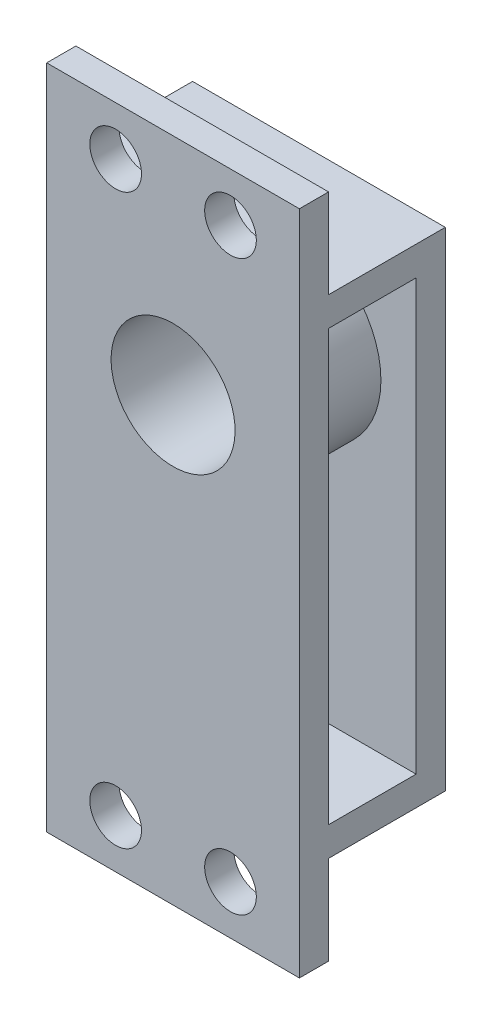
ISO-10303-21;
HEADER;
FILE_DESCRIPTION(('STEP AP214'),'2;1');
FILE_NAME('part.step','',(''),(''),'','','');
FILE_SCHEMA(('AUTOMOTIVE_DESIGN { 1 0 10303 214 1 1 1 1 }'));
ENDSEC;
DATA;
#1=APPLICATION_CONTEXT('core data for automotive mechanical design processes');
#2=APPLICATION_PROTOCOL_DEFINITION('international standard','automotive_design',2000,#1);
#3=PRODUCT_CONTEXT('',#1,'mechanical');
#4=PRODUCT('Part','Part','',(#3));
#5=PRODUCT_RELATED_PRODUCT_CATEGORY('part','',(#4));
#6=PRODUCT_DEFINITION_FORMATION('','',#4);
#7=PRODUCT_DEFINITION_CONTEXT('part definition',#1,'design');
#8=PRODUCT_DEFINITION('design','',#6,#7);
#9=PRODUCT_DEFINITION_SHAPE('','',#8);
#10=(LENGTH_UNIT() NAMED_UNIT(*) SI_UNIT(.MILLI.,.METRE.));
#11=(NAMED_UNIT(*) PLANE_ANGLE_UNIT() SI_UNIT($,.RADIAN.));
#12=(NAMED_UNIT(*) SI_UNIT($,.STERADIAN.) SOLID_ANGLE_UNIT());
#13=UNCERTAINTY_MEASURE_WITH_UNIT(LENGTH_MEASURE(1.E-05),#10,'distance_accuracy_value','');
#14=(GEOMETRIC_REPRESENTATION_CONTEXT(3) GLOBAL_UNCERTAINTY_ASSIGNED_CONTEXT((#13)) GLOBAL_UNIT_ASSIGNED_CONTEXT((#10,
#11,#12)) REPRESENTATION_CONTEXT('',''));
#15=CARTESIAN_POINT('',(0.,0.,0.));
#16=DIRECTION('',(0.,0.,1.));
#17=DIRECTION('',(1.,0.,0.));
#18=AXIS2_PLACEMENT_3D('',#15,#16,#17);
#19=CARTESIAN_POINT('',(0.,0.,0.));
#20=DIRECTION('',(0.,0.,1.));
#21=DIRECTION('',(1.,0.,0.));
#22=AXIS2_PLACEMENT_3D('',#19,#20,#21);
#23=PLANE('',#22);
#24=CARTESIAN_POINT('',(0.,9.4592,0.));
#25=DIRECTION('',(0.,0.,1.));
#26=DIRECTION('',(1.,0.,0.));
#27=AXIS2_PLACEMENT_3D('',#24,#25,#26);
#28=CIRCLE('',#27,7.9375);
#29=CARTESIAN_POINT('',(7.9375,9.4592,0.));
#30=VERTEX_POINT('',#29);
#31=EDGE_CURVE('E305',#30,#30,#28,.F.);
#32=ORIENTED_EDGE('',*,*,#31,.F.);
#33=EDGE_LOOP('',(#32));
#34=FACE_BOUND('',#33,.T.);
#35=DIRECTION('',(-1.,0.,0.));
#36=VECTOR('',#35,1.);
#37=CARTESIAN_POINT('',(54.6975468418995,-18.71,0.));
#38=LINE('',#37,#36);
#39=CARTESIAN_POINT('',(11.,-18.71,0.));
#40=VERTEX_POINT('',#39);
#41=CARTESIAN_POINT('',(-11.,-18.71,0.));
#42=VERTEX_POINT('',#41);
#43=EDGE_CURVE('E71',#40,#42,#38,.T.);
#44=ORIENTED_EDGE('',*,*,#43,.T.);
#45=DIRECTION('',(0.,-1.,0.));
#46=VECTOR('',#45,1.);
#47=CARTESIAN_POINT('',(-11.,29.,0.));
#48=LINE('',#47,#46);
#49=CARTESIAN_POINT('',(-11.,18.71,0.));
#50=VERTEX_POINT('',#49);
#51=EDGE_CURVE('E166',#50,#42,#48,.T.);
#52=ORIENTED_EDGE('',*,*,#51,.F.);
#53=DIRECTION('',(-1.,0.,0.));
#54=VECTOR('',#53,1.);
#55=CARTESIAN_POINT('',(54.6975468418995,18.71,0.));
#56=LINE('',#55,#54);
#57=CARTESIAN_POINT('',(11.,18.71,0.));
#58=VERTEX_POINT('',#57);
#59=EDGE_CURVE('E199',#58,#50,#56,.T.);
#60=ORIENTED_EDGE('',*,*,#59,.F.);
#61=DIRECTION('',(0.,1.,0.));
#62=VECTOR('',#61,1.);
#63=CARTESIAN_POINT('',(11.,29.,0.));
#64=LINE('',#63,#62);
#65=EDGE_CURVE('E214',#40,#58,#64,.T.);
#66=ORIENTED_EDGE('',*,*,#65,.F.);
#67=EDGE_LOOP('',(#44,#52,#60,#66));
#68=FACE_BOUND('',#67,.T.);
#69=ADVANCED_FACE('F48',(#34,#68),#23,.F.);
#70=CARTESIAN_POINT('',(5.,24.75,0.));
#71=DIRECTION('',(0.,0.,-1.));
#72=DIRECTION('',(-1.,0.,0.));
#73=AXIS2_PLACEMENT_3D('',#70,#71,#72);
#74=CIRCLE('',#73,2.25);
#75=CARTESIAN_POINT('',(2.75,24.75,0.));
#76=VERTEX_POINT('',#75);
#77=EDGE_CURVE('E341',#76,#76,#74,.T.);
#78=ORIENTED_EDGE('',*,*,#77,.F.);
#79=EDGE_LOOP('',(#78));
#80=FACE_BOUND('',#79,.T.);
#81=CARTESIAN_POINT('',(-5.,24.75,0.));
#82=DIRECTION('',(0.,0.,-1.));
#83=DIRECTION('',(-1.,0.,0.));
#84=AXIS2_PLACEMENT_3D('',#81,#82,#83);
#85=CIRCLE('',#84,2.25);
#86=CARTESIAN_POINT('',(-7.25,24.75,0.));
#87=VERTEX_POINT('',#86);
#88=EDGE_CURVE('E345',#87,#87,#85,.T.);
#89=ORIENTED_EDGE('',*,*,#88,.F.);
#90=EDGE_LOOP('',(#89));
#91=FACE_BOUND('',#90,.T.);
#92=CARTESIAN_POINT('',(11.,21.25,0.));
#93=VERTEX_POINT('',#92);
#94=CARTESIAN_POINT('',(11.,29.,0.));
#95=VERTEX_POINT('',#94);
#96=EDGE_CURVE('E197',#93,#95,#64,.T.);
#97=ORIENTED_EDGE('',*,*,#96,.F.);
#98=DIRECTION('',(-1.,0.,0.));
#99=VECTOR('',#98,1.);
#100=CARTESIAN_POINT('',(54.6975468418995,21.25,0.));
#101=LINE('',#100,#99);
#102=CARTESIAN_POINT('',(-11.,21.25,0.));
#103=VERTEX_POINT('',#102);
#104=EDGE_CURVE('E63',#93,#103,#101,.T.);
#105=ORIENTED_EDGE('',*,*,#104,.T.);
#106=CARTESIAN_POINT('',(-11.,29.,0.));
#107=VERTEX_POINT('',#106);
#108=EDGE_CURVE('E169',#107,#103,#48,.T.);
#109=ORIENTED_EDGE('',*,*,#108,.F.);
#110=DIRECTION('',(-1.,0.,0.));
#111=VECTOR('',#110,1.);
#112=CARTESIAN_POINT('',(-11.,29.,0.));
#113=LINE('',#112,#111);
#114=EDGE_CURVE('E167',#95,#107,#113,.T.);
#115=ORIENTED_EDGE('',*,*,#114,.F.);
#116=EDGE_LOOP('',(#97,#105,#109,#115));
#117=FACE_BOUND('',#116,.T.);
#118=ADVANCED_FACE('F196',(#80,#91,#117),#23,.F.);
#119=CARTESIAN_POINT('',(11.,29.,2.53999999999999));
#120=DIRECTION('',(-1.,0.,0.));
#121=DIRECTION('',(0.,-1.,0.));
#122=AXIS2_PLACEMENT_3D('',#119,#120,#121);
#123=PLANE('',#122);
#124=DIRECTION('',(0.,0.,1.));
#125=VECTOR('',#124,1.);
#126=CARTESIAN_POINT('',(11.,21.25,0.));
#127=LINE('',#126,#125);
#128=CARTESIAN_POINT('',(11.,21.25,-10.16));
#129=VERTEX_POINT('',#128);
#130=EDGE_CURVE('E220',#129,#93,#127,.T.);
#131=ORIENTED_EDGE('',*,*,#130,.T.);
#132=ORIENTED_EDGE('',*,*,#96,.T.);
#133=DIRECTION('',(0.,0.,-1.));
#134=VECTOR('',#133,1.);
#135=CARTESIAN_POINT('',(11.,29.,2.53999999999999));
#136=LINE('',#135,#134);
#137=CARTESIAN_POINT('',(11.,29.,2.53999999999999));
#138=VERTEX_POINT('',#137);
#139=EDGE_CURVE('E13',#138,#95,#136,.T.);
#140=ORIENTED_EDGE('',*,*,#139,.F.);
#141=DIRECTION('',(0.,1.,0.));
#142=VECTOR('',#141,1.);
#143=CARTESIAN_POINT('',(11.,29.,2.53999999999999));
#144=LINE('',#143,#142);
#145=CARTESIAN_POINT('',(11.,-29.,2.53999999999999));
#146=VERTEX_POINT('',#145);
#147=EDGE_CURVE('E177',#146,#138,#144,.T.);
#148=ORIENTED_EDGE('',*,*,#147,.F.);
#149=DIRECTION('',(0.,0.,-1.));
#150=VECTOR('',#149,1.);
#151=CARTESIAN_POINT('',(11.,-29.,2.53999999999999));
#152=LINE('',#151,#150);
#153=CARTESIAN_POINT('',(11.,-29.,0.));
#154=VERTEX_POINT('',#153);
#155=EDGE_CURVE('E185',#146,#154,#152,.T.);
#156=ORIENTED_EDGE('',*,*,#155,.T.);
#157=CARTESIAN_POINT('',(11.,-21.25,0.));
#158=VERTEX_POINT('',#157);
#159=EDGE_CURVE('E171',#154,#158,#64,.T.);
#160=ORIENTED_EDGE('',*,*,#159,.T.);
#161=DIRECTION('',(0.,0.,-1.));
#162=VECTOR('',#161,1.);
#163=CARTESIAN_POINT('',(11.,-21.25,-10.16));
#164=LINE('',#163,#162);
#165=CARTESIAN_POINT('',(11.,-21.25,-10.16));
#166=VERTEX_POINT('',#165);
#167=EDGE_CURVE('E145',#158,#166,#164,.T.);
#168=ORIENTED_EDGE('',*,*,#167,.T.);
#169=DIRECTION('',(0.,1.,0.));
#170=VECTOR('',#169,1.);
#171=CARTESIAN_POINT('',(11.,21.25,-10.16));
#172=LINE('',#171,#170);
#173=EDGE_CURVE('E218',#166,#129,#172,.T.);
#174=ORIENTED_EDGE('',*,*,#173,.T.);
#175=EDGE_LOOP('',(#131,#132,#140,#148,#156,#160,#168,#174));
#176=FACE_BOUND('',#175,.T.);
#177=ORIENTED_EDGE('',*,*,#65,.T.);
#178=DIRECTION('',(0.,0.,1.));
#179=VECTOR('',#178,1.);
#180=CARTESIAN_POINT('',(11.,18.71,0.));
#181=LINE('',#180,#179);
#182=CARTESIAN_POINT('',(11.,18.71,-7.61999999999999));
#183=VERTEX_POINT('',#182);
#184=EDGE_CURVE('E239',#183,#58,#181,.T.);
#185=ORIENTED_EDGE('',*,*,#184,.F.);
#186=DIRECTION('',(0.,1.,0.));
#187=VECTOR('',#186,1.);
#188=CARTESIAN_POINT('',(11.,21.25,-7.61999999999999));
#189=LINE('',#188,#187);
#190=CARTESIAN_POINT('',(11.,-18.71,-7.61999999999999));
#191=VERTEX_POINT('',#190);
#192=EDGE_CURVE('E236',#191,#183,#189,.T.);
#193=ORIENTED_EDGE('',*,*,#192,.F.);
#194=DIRECTION('',(0.,0.,-1.));
#195=VECTOR('',#194,1.);
#196=CARTESIAN_POINT('',(11.,-18.71,-10.16));
#197=LINE('',#196,#195);
#198=EDGE_CURVE('E233',#40,#191,#197,.T.);
#199=ORIENTED_EDGE('',*,*,#198,.F.);
#200=EDGE_LOOP('',(#177,#185,#193,#199));
#201=FACE_BOUND('',#200,.T.);
#202=ADVANCED_FACE('F50',(#176,#201),#123,.F.);
#203=CARTESIAN_POINT('',(-11.,29.,2.53999999999999));
#204=DIRECTION('',(0.,-1.,0.));
#205=DIRECTION('',(0.,0.,-1.));
#206=AXIS2_PLACEMENT_3D('',#203,#204,#205);
#207=PLANE('',#206);
#208=ORIENTED_EDGE('',*,*,#114,.T.);
#209=DIRECTION('',(0.,0.,-1.));
#210=VECTOR('',#209,1.);
#211=CARTESIAN_POINT('',(-11.,29.,2.53999999999999));
#212=LINE('',#211,#210);
#213=CARTESIAN_POINT('',(-11.,29.,2.53999999999999));
#214=VERTEX_POINT('',#213);
#215=EDGE_CURVE('E56',#214,#107,#212,.T.);
#216=ORIENTED_EDGE('',*,*,#215,.F.);
#217=DIRECTION('',(-1.,0.,0.));
#218=VECTOR('',#217,1.);
#219=CARTESIAN_POINT('',(-11.,29.,2.53999999999999));
#220=LINE('',#219,#218);
#221=EDGE_CURVE('E182',#138,#214,#220,.T.);
#222=ORIENTED_EDGE('',*,*,#221,.F.);
#223=ORIENTED_EDGE('',*,*,#139,.T.);
#224=EDGE_LOOP('',(#208,#216,#222,#223));
#225=FACE_BOUND('',#224,.T.);
#226=ADVANCED_FACE('F363',(#225),#207,.F.);
#227=CARTESIAN_POINT('',(-11.,29.,2.53999999999999));
#228=DIRECTION('',(1.,0.,0.));
#229=DIRECTION('',(0.,1.,0.));
#230=AXIS2_PLACEMENT_3D('',#227,#228,#229);
#231=PLANE('',#230);
#232=DIRECTION('',(0.,0.,1.));
#233=VECTOR('',#232,1.);
#234=CARTESIAN_POINT('',(-11.,-21.25,-10.16));
#235=LINE('',#234,#233);
#236=CARTESIAN_POINT('',(-11.,-21.25,-10.16));
#237=VERTEX_POINT('',#236);
#238=CARTESIAN_POINT('',(-11.,-21.25,0.));
#239=VERTEX_POINT('',#238);
#240=EDGE_CURVE('E143',#237,#239,#235,.T.);
#241=ORIENTED_EDGE('',*,*,#240,.T.);
#242=CARTESIAN_POINT('',(-11.,-29.,0.));
#243=VERTEX_POINT('',#242);
#244=EDGE_CURVE('E156',#239,#243,#48,.T.);
#245=ORIENTED_EDGE('',*,*,#244,.T.);
#246=DIRECTION('',(0.,0.,-1.));
#247=VECTOR('',#246,1.);
#248=CARTESIAN_POINT('',(-11.,-29.,2.53999999999999));
#249=LINE('',#248,#247);
#250=CARTESIAN_POINT('',(-11.,-29.,2.53999999999999));
#251=VERTEX_POINT('',#250);
#252=EDGE_CURVE('E187',#251,#243,#249,.T.);
#253=ORIENTED_EDGE('',*,*,#252,.F.);
#254=DIRECTION('',(0.,-1.,0.));
#255=VECTOR('',#254,1.);
#256=CARTESIAN_POINT('',(-11.,29.,2.53999999999999));
#257=LINE('',#256,#255);
#258=EDGE_CURVE('E191',#214,#251,#257,.T.);
#259=ORIENTED_EDGE('',*,*,#258,.F.);
#260=ORIENTED_EDGE('',*,*,#215,.T.);
#261=ORIENTED_EDGE('',*,*,#108,.T.);
#262=DIRECTION('',(0.,0.,-1.));
#263=VECTOR('',#262,1.);
#264=CARTESIAN_POINT('',(-11.,21.25,0.));
#265=LINE('',#264,#263);
#266=CARTESIAN_POINT('',(-11.,21.25,-10.16));
#267=VERTEX_POINT('',#266);
#268=EDGE_CURVE('E231',#103,#267,#265,.T.);
#269=ORIENTED_EDGE('',*,*,#268,.T.);
#270=DIRECTION('',(0.,-1.,0.));
#271=VECTOR('',#270,1.);
#272=CARTESIAN_POINT('',(-11.,21.25,-10.16));
#273=LINE('',#272,#271);
#274=EDGE_CURVE('E150',#267,#237,#273,.T.);
#275=ORIENTED_EDGE('',*,*,#274,.T.);
#276=EDGE_LOOP('',(#241,#245,#253,#259,#260,#261,#269,#275));
#277=FACE_BOUND('',#276,.T.);
#278=ORIENTED_EDGE('',*,*,#51,.T.);
#279=DIRECTION('',(0.,0.,1.));
#280=VECTOR('',#279,1.);
#281=CARTESIAN_POINT('',(-11.,-18.71,-10.16));
#282=LINE('',#281,#280);
#283=CARTESIAN_POINT('',(-11.,-18.71,-7.61999999999999));
#284=VERTEX_POINT('',#283);
#285=EDGE_CURVE('E160',#284,#42,#282,.T.);
#286=ORIENTED_EDGE('',*,*,#285,.F.);
#287=DIRECTION('',(0.,-1.,0.));
#288=VECTOR('',#287,1.);
#289=CARTESIAN_POINT('',(-11.,21.25,-7.61999999999999));
#290=LINE('',#289,#288);
#291=CARTESIAN_POINT('',(-11.,18.71,-7.61999999999999));
#292=VERTEX_POINT('',#291);
#293=EDGE_CURVE('E225',#292,#284,#290,.T.);
#294=ORIENTED_EDGE('',*,*,#293,.F.);
#295=DIRECTION('',(0.,0.,1.));
#296=VECTOR('',#295,1.);
#297=CARTESIAN_POINT('',(-11.,18.71,0.));
#298=LINE('',#297,#296);
#299=EDGE_CURVE('E228',#50,#292,#298,.F.);
#300=ORIENTED_EDGE('',*,*,#299,.F.);
#301=EDGE_LOOP('',(#278,#286,#294,#300));
#302=FACE_BOUND('',#301,.T.);
#303=ADVANCED_FACE('F153',(#277,#302),#231,.F.);
#304=CARTESIAN_POINT('',(-11.,-29.,2.53999999999999));
#305=DIRECTION('',(0.,1.,0.));
#306=DIRECTION('',(0.,0.,1.));
#307=AXIS2_PLACEMENT_3D('',#304,#305,#306);
#308=PLANE('',#307);
#309=DIRECTION('',(1.,0.,0.));
#310=VECTOR('',#309,1.);
#311=CARTESIAN_POINT('',(-11.,-29.,0.));
#312=LINE('',#311,#310);
#313=EDGE_CURVE('E165',#243,#154,#312,.T.);
#314=ORIENTED_EDGE('',*,*,#313,.T.);
#315=ORIENTED_EDGE('',*,*,#155,.F.);
#316=DIRECTION('',(1.,0.,0.));
#317=VECTOR('',#316,1.);
#318=CARTESIAN_POINT('',(-11.,-29.,2.53999999999999));
#319=LINE('',#318,#317);
#320=EDGE_CURVE('E188',#251,#146,#319,.T.);
#321=ORIENTED_EDGE('',*,*,#320,.F.);
#322=ORIENTED_EDGE('',*,*,#252,.T.);
#323=EDGE_LOOP('',(#314,#315,#321,#322));
#324=FACE_BOUND('',#323,.T.);
#325=ADVANCED_FACE('F282',(#324),#308,.F.);
#326=CARTESIAN_POINT('',(0.,0.,2.53999999999999));
#327=DIRECTION('',(0.,0.,1.));
#328=DIRECTION('',(1.,0.,0.));
#329=AXIS2_PLACEMENT_3D('',#326,#327,#328);
#330=PLANE('',#329);
#331=CARTESIAN_POINT('',(5.,24.75,2.53999999999999));
#332=DIRECTION('',(0.,0.,1.));
#333=DIRECTION('',(1.,0.,0.));
#334=AXIS2_PLACEMENT_3D('',#331,#332,#333);
#335=CIRCLE('',#334,2.25);
#336=CARTESIAN_POINT('',(7.25,24.75,2.53999999999999));
#337=VERTEX_POINT('',#336);
#338=EDGE_CURVE('E344',#337,#337,#335,.T.);
#339=ORIENTED_EDGE('',*,*,#338,.F.);
#340=EDGE_LOOP('',(#339));
#341=FACE_BOUND('',#340,.T.);
#342=CARTESIAN_POINT('',(-5.,24.75,2.53999999999999));
#343=DIRECTION('',(0.,0.,1.));
#344=DIRECTION('',(1.,0.,0.));
#345=AXIS2_PLACEMENT_3D('',#342,#343,#344);
#346=CIRCLE('',#345,2.25);
#347=CARTESIAN_POINT('',(-2.75,24.75,2.53999999999999));
#348=VERTEX_POINT('',#347);
#349=EDGE_CURVE('E348',#348,#348,#346,.T.);
#350=ORIENTED_EDGE('',*,*,#349,.F.);
#351=EDGE_LOOP('',(#350));
#352=FACE_BOUND('',#351,.T.);
#353=CARTESIAN_POINT('',(5.,-24.75,2.53999999999999));
#354=DIRECTION('',(0.,0.,1.));
#355=DIRECTION('',(1.,0.,0.));
#356=AXIS2_PLACEMENT_3D('',#353,#354,#355);
#357=CIRCLE('',#356,2.25);
#358=CARTESIAN_POINT('',(7.25,-24.75,2.53999999999999));
#359=VERTEX_POINT('',#358);
#360=EDGE_CURVE('E293',#359,#359,#357,.T.);
#361=ORIENTED_EDGE('',*,*,#360,.F.);
#362=EDGE_LOOP('',(#361));
#363=FACE_BOUND('',#362,.T.);
#364=CARTESIAN_POINT('',(-5.,-24.75,2.53999999999999));
#365=DIRECTION('',(0.,0.,1.));
#366=DIRECTION('',(1.,0.,0.));
#367=AXIS2_PLACEMENT_3D('',#364,#365,#366);
#368=CIRCLE('',#367,2.25);
#369=CARTESIAN_POINT('',(-2.75,-24.75,2.53999999999999));
#370=VERTEX_POINT('',#369);
#371=EDGE_CURVE('E292',#370,#370,#368,.T.);
#372=ORIENTED_EDGE('',*,*,#371,.F.);
#373=EDGE_LOOP('',(#372));
#374=FACE_BOUND('',#373,.T.);
#375=CARTESIAN_POINT('',(0.,9.4592,2.54000000000001));
#376=DIRECTION('',(0.,0.,-1.));
#377=DIRECTION('',(0.,1.,0.));
#378=AXIS2_PLACEMENT_3D('',#375,#376,#377);
#379=CIRCLE('',#378,5.3975);
#380=CARTESIAN_POINT('',(0.,14.8567,2.54000000000001));
#381=VERTEX_POINT('',#380);
#382=EDGE_CURVE('E302',#381,#381,#379,.T.);
#383=ORIENTED_EDGE('',*,*,#382,.T.);
#384=EDGE_LOOP('',(#383));
#385=FACE_BOUND('',#384,.T.);
#386=ORIENTED_EDGE('',*,*,#147,.T.);
#387=ORIENTED_EDGE('',*,*,#221,.T.);
#388=ORIENTED_EDGE('',*,*,#258,.T.);
#389=ORIENTED_EDGE('',*,*,#320,.T.);
#390=EDGE_LOOP('',(#386,#387,#388,#389));
#391=FACE_BOUND('',#390,.T.);
#392=ADVANCED_FACE('F274',(#341,#352,#363,#374,#385,#391),#330,.T.);
#393=CARTESIAN_POINT('',(5.,-24.75,0.));
#394=DIRECTION('',(0.,0.,-1.));
#395=DIRECTION('',(-1.,0.,0.));
#396=AXIS2_PLACEMENT_3D('',#393,#394,#395);
#397=CIRCLE('',#396,2.25);
#398=CARTESIAN_POINT('',(2.75,-24.75,0.));
#399=VERTEX_POINT('',#398);
#400=EDGE_CURVE('E287',#399,#399,#397,.T.);
#401=ORIENTED_EDGE('',*,*,#400,.F.);
#402=EDGE_LOOP('',(#401));
#403=FACE_BOUND('',#402,.T.);
#404=CARTESIAN_POINT('',(-5.,-24.75,0.));
#405=DIRECTION('',(0.,0.,-1.));
#406=DIRECTION('',(-1.,0.,0.));
#407=AXIS2_PLACEMENT_3D('',#404,#405,#406);
#408=CIRCLE('',#407,2.25);
#409=CARTESIAN_POINT('',(-7.25,-24.75,0.));
#410=VERTEX_POINT('',#409);
#411=EDGE_CURVE('E290',#410,#410,#408,.T.);
#412=ORIENTED_EDGE('',*,*,#411,.F.);
#413=EDGE_LOOP('',(#412));
#414=FACE_BOUND('',#413,.T.);
#415=ORIENTED_EDGE('',*,*,#244,.F.);
#416=DIRECTION('',(-1.,0.,0.));
#417=VECTOR('',#416,1.);
#418=CARTESIAN_POINT('',(54.6975468418995,-21.25,0.));
#419=LINE('',#418,#417);
#420=EDGE_CURVE('E139',#158,#239,#419,.T.);
#421=ORIENTED_EDGE('',*,*,#420,.F.);
#422=ORIENTED_EDGE('',*,*,#159,.F.);
#423=ORIENTED_EDGE('',*,*,#313,.F.);
#424=EDGE_LOOP('',(#415,#421,#422,#423));
#425=FACE_BOUND('',#424,.T.);
#426=ADVANCED_FACE('F164',(#403,#414,#425),#23,.F.);
#427=CARTESIAN_POINT('',(54.6975468418995,-18.71,-10.16));
#428=DIRECTION('',(0.,-1.,0.));
#429=DIRECTION('',(1.,0.,0.));
#430=AXIS2_PLACEMENT_3D('',#427,#428,#429);
#431=PLANE('',#430);
#432=ORIENTED_EDGE('',*,*,#43,.F.);
#433=ORIENTED_EDGE('',*,*,#198,.T.);
#434=DIRECTION('',(-1.,0.,0.));
#435=VECTOR('',#434,1.);
#436=CARTESIAN_POINT('',(54.6975468418995,-18.71,-7.61999999999999));
#437=LINE('',#436,#435);
#438=EDGE_CURVE('E208',#191,#284,#437,.T.);
#439=ORIENTED_EDGE('',*,*,#438,.T.);
#440=ORIENTED_EDGE('',*,*,#285,.T.);
#441=EDGE_LOOP('',(#432,#433,#439,#440));
#442=FACE_BOUND('',#441,.T.);
#443=ADVANCED_FACE('F273',(#442),#431,.F.);
#444=CARTESIAN_POINT('',(54.6975468418995,21.25,-7.61999999999999));
#445=DIRECTION('',(0.,0.,-1.));
#446=DIRECTION('',(0.,1.,0.));
#447=AXIS2_PLACEMENT_3D('',#444,#445,#446);
#448=PLANE('',#447);
#449=CARTESIAN_POINT('',(0.,9.4592,-7.61999999999999));
#450=DIRECTION('',(0.,0.,-1.));
#451=DIRECTION('',(0.,1.,0.));
#452=AXIS2_PLACEMENT_3D('',#449,#450,#451);
#453=CIRCLE('',#452,7.9375);
#454=CARTESIAN_POINT('',(0.,17.3967,-7.62));
#455=VERTEX_POINT('',#454);
#456=EDGE_CURVE('E161',#455,#455,#453,.T.);
#457=ORIENTED_EDGE('',*,*,#456,.T.);
#458=EDGE_LOOP('',(#457));
#459=FACE_BOUND('',#458,.T.);
#460=ORIENTED_EDGE('',*,*,#438,.F.);
#461=ORIENTED_EDGE('',*,*,#192,.T.);
#462=DIRECTION('',(-1.,0.,0.));
#463=VECTOR('',#462,1.);
#464=CARTESIAN_POINT('',(54.6975468418995,18.71,-7.61999999999999));
#465=LINE('',#464,#463);
#466=EDGE_CURVE('E203',#183,#292,#465,.T.);
#467=ORIENTED_EDGE('',*,*,#466,.T.);
#468=ORIENTED_EDGE('',*,*,#293,.T.);
#469=EDGE_LOOP('',(#460,#461,#467,#468));
#470=FACE_BOUND('',#469,.T.);
#471=ADVANCED_FACE('F280',(#459,#470),#448,.F.);
#472=CARTESIAN_POINT('',(54.6975468418995,18.71,0.));
#473=DIRECTION('',(0.,1.,0.));
#474=DIRECTION('',(-1.,0.,0.));
#475=AXIS2_PLACEMENT_3D('',#472,#473,#474);
#476=PLANE('',#475);
#477=ORIENTED_EDGE('',*,*,#466,.F.);
#478=ORIENTED_EDGE('',*,*,#184,.T.);
#479=ORIENTED_EDGE('',*,*,#59,.T.);
#480=ORIENTED_EDGE('',*,*,#299,.T.);
#481=EDGE_LOOP('',(#477,#478,#479,#480));
#482=FACE_BOUND('',#481,.T.);
#483=ADVANCED_FACE('F257',(#482),#476,.F.);
#484=CARTESIAN_POINT('',(54.6975468418995,21.25,0.));
#485=DIRECTION('',(0.,1.,0.));
#486=DIRECTION('',(-1.,0.,0.));
#487=AXIS2_PLACEMENT_3D('',#484,#485,#486);
#488=PLANE('',#487);
#489=ORIENTED_EDGE('',*,*,#130,.F.);
#490=DIRECTION('',(-1.,0.,0.));
#491=VECTOR('',#490,1.);
#492=CARTESIAN_POINT('',(54.6975468418995,21.25,-10.16));
#493=LINE('',#492,#491);
#494=EDGE_CURVE('E198',#129,#267,#493,.T.);
#495=ORIENTED_EDGE('',*,*,#494,.T.);
#496=ORIENTED_EDGE('',*,*,#268,.F.);
#497=ORIENTED_EDGE('',*,*,#104,.F.);
#498=EDGE_LOOP('',(#489,#495,#496,#497));
#499=FACE_BOUND('',#498,.T.);
#500=ADVANCED_FACE('F246',(#499),#488,.T.);
#501=CARTESIAN_POINT('',(54.6975468418995,21.25,-10.16));
#502=DIRECTION('',(0.,0.,-1.));
#503=DIRECTION('',(0.,1.,0.));
#504=AXIS2_PLACEMENT_3D('',#501,#502,#503);
#505=PLANE('',#504);
#506=CARTESIAN_POINT('',(0.,9.4592,-10.16));
#507=DIRECTION('',(0.,0.,-1.));
#508=DIRECTION('',(0.,1.,0.));
#509=AXIS2_PLACEMENT_3D('',#506,#507,#508);
#510=CIRCLE('',#509,5.3975);
#511=CARTESIAN_POINT('',(0.,14.8567,-10.16));
#512=VERTEX_POINT('',#511);
#513=EDGE_CURVE('E296',#512,#512,#510,.T.);
#514=ORIENTED_EDGE('',*,*,#513,.F.);
#515=EDGE_LOOP('',(#514));
#516=FACE_BOUND('',#515,.T.);
#517=ORIENTED_EDGE('',*,*,#173,.F.);
#518=DIRECTION('',(-1.,0.,0.));
#519=VECTOR('',#518,1.);
#520=CARTESIAN_POINT('',(54.6975468418995,-21.25,-10.16));
#521=LINE('',#520,#519);
#522=EDGE_CURVE('E201',#166,#237,#521,.T.);
#523=ORIENTED_EDGE('',*,*,#522,.T.);
#524=ORIENTED_EDGE('',*,*,#274,.F.);
#525=ORIENTED_EDGE('',*,*,#494,.F.);
#526=EDGE_LOOP('',(#517,#523,#524,#525));
#527=FACE_BOUND('',#526,.T.);
#528=ADVANCED_FACE('F247',(#516,#527),#505,.T.);
#529=CARTESIAN_POINT('',(54.6975468418995,-21.25,-10.16));
#530=DIRECTION('',(0.,-1.,0.));
#531=DIRECTION('',(1.,0.,0.));
#532=AXIS2_PLACEMENT_3D('',#529,#530,#531);
#533=PLANE('',#532);
#534=ORIENTED_EDGE('',*,*,#167,.F.);
#535=ORIENTED_EDGE('',*,*,#420,.T.);
#536=ORIENTED_EDGE('',*,*,#240,.F.);
#537=ORIENTED_EDGE('',*,*,#522,.F.);
#538=EDGE_LOOP('',(#534,#535,#536,#537));
#539=FACE_BOUND('',#538,.T.);
#540=ADVANCED_FACE('F141',(#539),#533,.T.);
#541=CARTESIAN_POINT('',(0.,9.4592,22.4506403026729));
#542=DIRECTION('',(0.,0.,-1.));
#543=DIRECTION('',(0.,1.,0.));
#544=AXIS2_PLACEMENT_3D('',#541,#542,#543);
#545=CYLINDRICAL_SURFACE('',#544,7.9375);
#546=ORIENTED_EDGE('',*,*,#31,.T.);
#547=EDGE_LOOP('',(#546));
#548=FACE_BOUND('',#547,.T.);
#549=ORIENTED_EDGE('',*,*,#456,.F.);
#550=EDGE_LOOP('',(#549));
#551=FACE_BOUND('',#550,.T.);
#552=ADVANCED_FACE('F255',(#548,#551),#545,.T.);
#553=CARTESIAN_POINT('',(0.,9.4592,22.4506403026729));
#554=DIRECTION('',(0.,0.,-1.));
#555=DIRECTION('',(0.,1.,0.));
#556=AXIS2_PLACEMENT_3D('',#553,#554,#555);
#557=CYLINDRICAL_SURFACE('',#556,5.3975);
#558=ORIENTED_EDGE('',*,*,#382,.F.);
#559=EDGE_LOOP('',(#558));
#560=FACE_BOUND('',#559,.T.);
#561=ORIENTED_EDGE('',*,*,#513,.T.);
#562=EDGE_LOOP('',(#561));
#563=FACE_BOUND('',#562,.T.);
#564=ADVANCED_FACE('F315',(#560,#563),#557,.F.);
#565=CARTESIAN_POINT('',(-5.,-24.75,0.));
#566=DIRECTION('',(0.,0.,-1.));
#567=DIRECTION('',(-1.,0.,0.));
#568=AXIS2_PLACEMENT_3D('',#565,#566,#567);
#569=CYLINDRICAL_SURFACE('',#568,2.25);
#570=ORIENTED_EDGE('',*,*,#411,.T.);
#571=EDGE_LOOP('',(#570));
#572=FACE_BOUND('',#571,.T.);
#573=ORIENTED_EDGE('',*,*,#371,.T.);
#574=EDGE_LOOP('',(#573));
#575=FACE_BOUND('',#574,.T.);
#576=ADVANCED_FACE('F320',(#572,#575),#569,.F.);
#577=CARTESIAN_POINT('',(5.,-24.75,0.));
#578=DIRECTION('',(0.,0.,-1.));
#579=DIRECTION('',(-1.,0.,0.));
#580=AXIS2_PLACEMENT_3D('',#577,#578,#579);
#581=CYLINDRICAL_SURFACE('',#580,2.25);
#582=ORIENTED_EDGE('',*,*,#400,.T.);
#583=EDGE_LOOP('',(#582));
#584=FACE_BOUND('',#583,.T.);
#585=ORIENTED_EDGE('',*,*,#360,.T.);
#586=EDGE_LOOP('',(#585));
#587=FACE_BOUND('',#586,.T.);
#588=ADVANCED_FACE('F325',(#584,#587),#581,.F.);
#589=CARTESIAN_POINT('',(-5.,24.75,0.));
#590=DIRECTION('',(0.,0.,-1.));
#591=DIRECTION('',(-1.,0.,0.));
#592=AXIS2_PLACEMENT_3D('',#589,#590,#591);
#593=CYLINDRICAL_SURFACE('',#592,2.25);
#594=ORIENTED_EDGE('',*,*,#88,.T.);
#595=EDGE_LOOP('',(#594));
#596=FACE_BOUND('',#595,.T.);
#597=ORIENTED_EDGE('',*,*,#349,.T.);
#598=EDGE_LOOP('',(#597));
#599=FACE_BOUND('',#598,.T.);
#600=ADVANCED_FACE('F328',(#596,#599),#593,.F.);
#601=CARTESIAN_POINT('',(5.,24.75,0.));
#602=DIRECTION('',(0.,0.,-1.));
#603=DIRECTION('',(-1.,0.,0.));
#604=AXIS2_PLACEMENT_3D('',#601,#602,#603);
#605=CYLINDRICAL_SURFACE('',#604,2.25);
#606=ORIENTED_EDGE('',*,*,#77,.T.);
#607=EDGE_LOOP('',(#606));
#608=FACE_BOUND('',#607,.T.);
#609=ORIENTED_EDGE('',*,*,#338,.T.);
#610=EDGE_LOOP('',(#609));
#611=FACE_BOUND('',#610,.T.);
#612=ADVANCED_FACE('F332',(#608,#611),#605,.F.);
#613=CLOSED_SHELL('',(#69,#118,#202,#226,#303,#325,#392,#426,#443,#471,#483,#500,#528,#540,#552,
#564,#576,#588,#600,#612));
#614=MANIFOLD_SOLID_BREP('B2',#613);
#615=ADVANCED_BREP_SHAPE_REPRESENTATION('',(#18,#614),#14);
#616=SHAPE_DEFINITION_REPRESENTATION(#9,#615);
ENDSEC;
END-ISO-10303-21;
